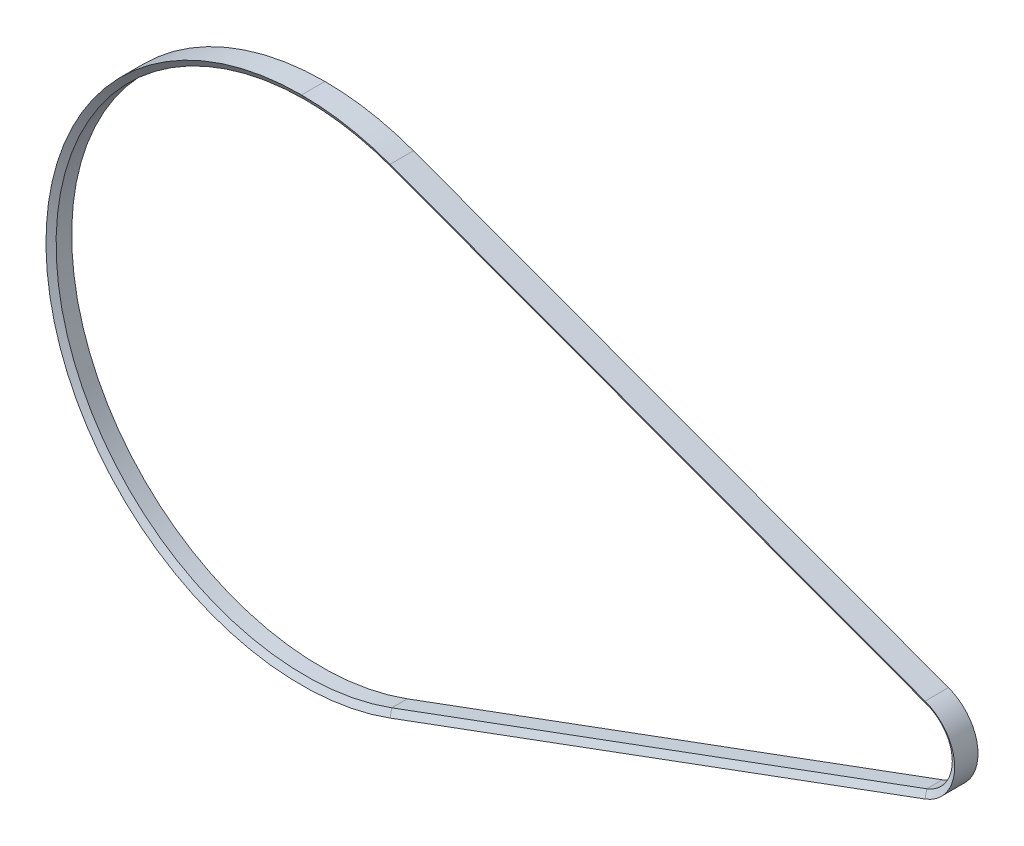
ISO-10303-21;
HEADER;
FILE_DESCRIPTION(('STEP AP214'),'2;1');
FILE_NAME('part.step','',(''),(''),'','','');
FILE_SCHEMA(('AUTOMOTIVE_DESIGN { 1 0 10303 214 1 1 1 1 }'));
ENDSEC;
DATA;
#1=APPLICATION_CONTEXT('core data for automotive mechanical design processes');
#2=APPLICATION_PROTOCOL_DEFINITION('international standard','automotive_design',2000,#1);
#3=PRODUCT_CONTEXT('',#1,'mechanical');
#4=PRODUCT('Part','Part','',(#3));
#5=PRODUCT_RELATED_PRODUCT_CATEGORY('part','',(#4));
#6=PRODUCT_DEFINITION_FORMATION('','',#4);
#7=PRODUCT_DEFINITION_CONTEXT('part definition',#1,'design');
#8=PRODUCT_DEFINITION('design','',#6,#7);
#9=PRODUCT_DEFINITION_SHAPE('','',#8);
#10=(LENGTH_UNIT() NAMED_UNIT(*) SI_UNIT(.MILLI.,.METRE.));
#11=(NAMED_UNIT(*) PLANE_ANGLE_UNIT() SI_UNIT($,.RADIAN.));
#12=(NAMED_UNIT(*) SI_UNIT($,.STERADIAN.) SOLID_ANGLE_UNIT());
#13=UNCERTAINTY_MEASURE_WITH_UNIT(LENGTH_MEASURE(1.E-05),#10,'distance_accuracy_value','');
#14=(GEOMETRIC_REPRESENTATION_CONTEXT(3) GLOBAL_UNCERTAINTY_ASSIGNED_CONTEXT((#13)) GLOBAL_UNIT_ASSIGNED_CONTEXT((#10,
#11,#12)) REPRESENTATION_CONTEXT('',''));
#15=CARTESIAN_POINT('',(0.,0.,0.));
#16=DIRECTION('',(0.,0.,1.));
#17=DIRECTION('',(1.,0.,0.));
#18=AXIS2_PLACEMENT_3D('',#15,#16,#17);
#19=CARTESIAN_POINT('',(0.,0.,0.));
#20=DIRECTION('',(0.,0.,-1.));
#21=DIRECTION('',(-1.,0.,0.));
#22=AXIS2_PLACEMENT_3D('',#19,#20,#21);
#23=CYLINDRICAL_SURFACE('',#22,208.28);
#24=CARTESIAN_POINT('',(0.,0.,-9.52499999999999));
#25=DIRECTION('',(0.,0.,-1.));
#26=DIRECTION('',(0.346153846153846,-0.93817776289619,0.));
#27=AXIS2_PLACEMENT_3D('',#24,#25,#26);
#28=CIRCLE('',#27,208.28);
#29=CARTESIAN_POINT('',(72.096923076923,-195.403664456018,-9.52499999999999));
#30=VERTEX_POINT('',#29);
#31=CARTESIAN_POINT('',(0.,208.28,-9.52499999999999));
#32=VERTEX_POINT('',#31);
#33=EDGE_CURVE('E11',#30,#32,#28,.T.);
#34=ORIENTED_EDGE('',*,*,#33,.F.);
#35=DIRECTION('',(0.,0.,1.));
#36=VECTOR('',#35,1.);
#37=CARTESIAN_POINT('',(72.0969230769231,-195.403664456018,9.52500000000001));
#38=LINE('',#37,#36);
#39=CARTESIAN_POINT('',(72.096923076923,-195.403664456018,9.52500000000001));
#40=VERTEX_POINT('',#39);
#41=EDGE_CURVE('E36',#30,#40,#38,.T.);
#42=ORIENTED_EDGE('',*,*,#41,.T.);
#43=CARTESIAN_POINT('',(0.,0.,9.52500000000001));
#44=DIRECTION('',(0.,0.,-1.));
#45=DIRECTION('',(0.346153846153846,-0.93817776289619,0.));
#46=AXIS2_PLACEMENT_3D('',#43,#44,#45);
#47=CIRCLE('',#46,208.28);
#48=CARTESIAN_POINT('',(0.,208.28,9.52500000000001));
#49=VERTEX_POINT('',#48);
#50=EDGE_CURVE('E130',#40,#49,#47,.T.);
#51=ORIENTED_EDGE('',*,*,#50,.T.);
#52=DIRECTION('',(0.,0.,1.));
#53=VECTOR('',#52,1.);
#54=CARTESIAN_POINT('',(0.,208.28,9.52500000000001));
#55=LINE('',#54,#53);
#56=EDGE_CURVE('E133',#32,#49,#55,.T.);
#57=ORIENTED_EDGE('',*,*,#56,.F.);
#58=EDGE_LOOP('',(#34,#42,#51,#57));
#59=FACE_BOUND('',#58,.T.);
#60=ADVANCED_FACE('F33',(#59),#23,.T.);
#61=CARTESIAN_POINT('',(0.,0.,-6.35));
#62=DIRECTION('',(0.,0.,-1.));
#63=DIRECTION('',(-1.,0.,0.));
#64=AXIS2_PLACEMENT_3D('',#61,#62,#63);
#65=CONICAL_SURFACE('',#64,203.2,1.01219701145134);
#66=CARTESIAN_POINT('',(0.,0.,-6.35));
#67=DIRECTION('',(0.,0.,-1.));
#68=DIRECTION('',(0.346153846153846,-0.93817776289619,0.));
#69=AXIS2_PLACEMENT_3D('',#66,#67,#68);
#70=CIRCLE('',#69,203.2);
#71=CARTESIAN_POINT('',(70.3384615384615,-190.637721420506,-6.35));
#72=VERTEX_POINT('',#71);
#73=CARTESIAN_POINT('',(0.,203.2,-6.35));
#74=VERTEX_POINT('',#73);
#75=EDGE_CURVE('E41',#72,#74,#70,.T.);
#76=ORIENTED_EDGE('',*,*,#75,.F.);
#77=DIRECTION('',(0.293537874463301,-0.79557315179126,-0.529998940003174));
#78=VECTOR('',#77,1.);
#79=CARTESIAN_POINT('',(72.0969230769231,-195.403664456018,-9.52499999999999));
#80=LINE('',#79,#78);
#81=EDGE_CURVE('E216',#72,#30,#80,.T.);
#82=ORIENTED_EDGE('',*,*,#81,.T.);
#83=ORIENTED_EDGE('',*,*,#33,.T.);
#84=DIRECTION('',(0.,0.847998304005092,-0.529998940003174));
#85=VECTOR('',#84,1.);
#86=CARTESIAN_POINT('',(0.,208.28,-9.52499999999999));
#87=LINE('',#86,#85);
#88=EDGE_CURVE('E158',#74,#32,#87,.T.);
#89=ORIENTED_EDGE('',*,*,#88,.F.);
#90=EDGE_LOOP('',(#76,#82,#83,#89));
#91=FACE_BOUND('',#90,.T.);
#92=ADVANCED_FACE('F275',(#91),#65,.F.);
#93=CARTESIAN_POINT('',(0.,0.,0.));
#94=DIRECTION('',(0.,0.,-1.));
#95=DIRECTION('',(-1.,0.,0.));
#96=AXIS2_PLACEMENT_3D('',#93,#94,#95);
#97=CYLINDRICAL_SURFACE('',#96,203.2);
#98=CARTESIAN_POINT('',(0.,0.,6.35000000000002));
#99=DIRECTION('',(0.,0.,-1.));
#100=DIRECTION('',(0.346153846153846,-0.93817776289619,0.));
#101=AXIS2_PLACEMENT_3D('',#98,#99,#100);
#102=CIRCLE('',#101,203.2);
#103=CARTESIAN_POINT('',(70.3384615384615,-190.637721420506,6.35000000000002));
#104=VERTEX_POINT('',#103);
#105=CARTESIAN_POINT('',(0.,203.2,6.35000000000002));
#106=VERTEX_POINT('',#105);
#107=EDGE_CURVE('E139',#104,#106,#102,.T.);
#108=ORIENTED_EDGE('',*,*,#107,.F.);
#109=DIRECTION('',(0.,0.,-1.));
#110=VECTOR('',#109,1.);
#111=CARTESIAN_POINT('',(70.3384615384615,-190.637721420506,6.35000000000002));
#112=LINE('',#111,#110);
#113=EDGE_CURVE('E194',#104,#72,#112,.T.);
#114=ORIENTED_EDGE('',*,*,#113,.T.);
#115=ORIENTED_EDGE('',*,*,#75,.T.);
#116=DIRECTION('',(0.,0.,-1.));
#117=VECTOR('',#116,1.);
#118=CARTESIAN_POINT('',(0.,203.2,6.35000000000002));
#119=LINE('',#118,#117);
#120=EDGE_CURVE('E163',#106,#74,#119,.T.);
#121=ORIENTED_EDGE('',*,*,#120,.F.);
#122=EDGE_LOOP('',(#108,#114,#115,#121));
#123=FACE_BOUND('',#122,.T.);
#124=ADVANCED_FACE('F279',(#123),#97,.F.);
#125=CARTESIAN_POINT('',(508.048846153846,-34.5530870074667,9.52500000000001));
#126=DIRECTION('',(0.346153846153846,-0.93817776289619,0.));
#127=DIRECTION('',(0.93817776289619,0.346153846153846,0.));
#128=AXIS2_PLACEMENT_3D('',#125,#126,#127);
#129=PLANE('',#128);
#130=ORIENTED_EDGE('',*,*,#41,.F.);
#131=DIRECTION('',(-0.93817776289619,-0.346153846153846,0.));
#132=VECTOR('',#131,1.);
#133=CARTESIAN_POINT('',(508.048846153846,-34.5530870074667,-9.52499999999999));
#134=LINE('',#133,#132);
#135=CARTESIAN_POINT('',(508.048846153846,-34.5530870074667,-9.52499999999999));
#136=VERTEX_POINT('',#135);
#137=EDGE_CURVE('E49',#136,#30,#134,.T.);
#138=ORIENTED_EDGE('',*,*,#137,.F.);
#139=DIRECTION('',(0.,0.,1.));
#140=VECTOR('',#139,1.);
#141=CARTESIAN_POINT('',(508.048846153846,-34.5530870074667,9.52500000000001));
#142=LINE('',#141,#140);
#143=CARTESIAN_POINT('',(508.048846153846,-34.5530870074667,9.52500000000001));
#144=VERTEX_POINT('',#143);
#145=EDGE_CURVE('E198',#136,#144,#142,.T.);
#146=ORIENTED_EDGE('',*,*,#145,.T.);
#147=DIRECTION('',(-0.93817776289619,-0.346153846153846,0.));
#148=VECTOR('',#147,1.);
#149=CARTESIAN_POINT('',(508.048846153846,-34.5530870074667,9.52500000000001));
#150=LINE('',#149,#148);
#151=EDGE_CURVE('E196',#144,#40,#150,.T.);
#152=ORIENTED_EDGE('',*,*,#151,.T.);
#153=EDGE_LOOP('',(#130,#138,#146,#152));
#154=FACE_BOUND('',#153,.T.);
#155=ADVANCED_FACE('F238',(#154),#129,.T.);
#156=CARTESIAN_POINT('',(508.048846153846,-34.5530870074667,-9.52499999999999));
#157=DIRECTION('',(-0.18346117153956,0.49723321986953,-0.847998304005092));
#158=DIRECTION('',(0.,0.862639928451234,0.50581849891206));
#159=AXIS2_PLACEMENT_3D('',#156,#157,#158);
#160=PLANE('',#159);
#161=ORIENTED_EDGE('',*,*,#137,.T.);
#162=ORIENTED_EDGE('',*,*,#81,.F.);
#163=DIRECTION('',(-0.93817776289619,-0.346153846153846,0.));
#164=VECTOR('',#163,1.);
#165=CARTESIAN_POINT('',(506.290384615385,-29.787143971954,-6.35));
#166=LINE('',#165,#164);
#167=CARTESIAN_POINT('',(506.290384615385,-29.787143971954,-6.35));
#168=VERTEX_POINT('',#167);
#169=EDGE_CURVE('E58',#168,#72,#166,.T.);
#170=ORIENTED_EDGE('',*,*,#169,.F.);
#171=DIRECTION('',(0.293537874463303,-0.795573151791259,-0.529998940003174));
#172=VECTOR('',#171,1.);
#173=CARTESIAN_POINT('',(508.048846153846,-34.5530870074667,-9.52499999999999));
#174=LINE('',#173,#172);
#175=EDGE_CURVE('E213',#168,#136,#174,.T.);
#176=ORIENTED_EDGE('',*,*,#175,.T.);
#177=EDGE_LOOP('',(#161,#162,#170,#176));
#178=FACE_BOUND('',#177,.T.);
#179=ADVANCED_FACE('F264',(#178),#160,.T.);
#180=CARTESIAN_POINT('',(506.290384615385,-29.787143971954,6.35000000000002));
#181=DIRECTION('',(-0.346153846153846,0.93817776289619,0.));
#182=DIRECTION('',(-0.93817776289619,-0.346153846153846,0.));
#183=AXIS2_PLACEMENT_3D('',#180,#181,#182);
#184=PLANE('',#183);
#185=ORIENTED_EDGE('',*,*,#169,.T.);
#186=ORIENTED_EDGE('',*,*,#113,.F.);
#187=DIRECTION('',(-0.93817776289619,-0.346153846153846,0.));
#188=VECTOR('',#187,1.);
#189=CARTESIAN_POINT('',(506.290384615385,-29.787143971954,6.35000000000002));
#190=LINE('',#189,#188);
#191=CARTESIAN_POINT('',(506.290384615385,-29.787143971954,6.35000000000002));
#192=VERTEX_POINT('',#191);
#193=EDGE_CURVE('E91',#192,#104,#190,.T.);
#194=ORIENTED_EDGE('',*,*,#193,.F.);
#195=DIRECTION('',(0.,0.,-1.));
#196=VECTOR('',#195,1.);
#197=CARTESIAN_POINT('',(506.290384615385,-29.787143971954,6.35000000000002));
#198=LINE('',#197,#196);
#199=EDGE_CURVE('E188',#192,#168,#198,.T.);
#200=ORIENTED_EDGE('',*,*,#199,.T.);
#201=EDGE_LOOP('',(#185,#186,#194,#200));
#202=FACE_BOUND('',#201,.T.);
#203=ADVANCED_FACE('F261',(#202),#184,.T.);
#204=CARTESIAN_POINT('',(508.048846153846,-34.5530870074667,9.52500000000001));
#205=DIRECTION('',(-0.18346117153956,0.49723321986953,0.847998304005092));
#206=DIRECTION('',(0.,-0.862639928451234,0.50581849891206));
#207=AXIS2_PLACEMENT_3D('',#204,#205,#206);
#208=PLANE('',#207);
#209=ORIENTED_EDGE('',*,*,#193,.T.);
#210=DIRECTION('',(-0.293537874463301,0.79557315179126,-0.529998940003174));
#211=VECTOR('',#210,1.);
#212=CARTESIAN_POINT('',(72.0969230769231,-195.403664456018,9.52500000000001));
#213=LINE('',#212,#211);
#214=EDGE_CURVE('E192',#40,#104,#213,.T.);
#215=ORIENTED_EDGE('',*,*,#214,.F.);
#216=ORIENTED_EDGE('',*,*,#151,.F.);
#217=DIRECTION('',(-0.293537874463303,0.795573151791259,-0.529998940003174));
#218=VECTOR('',#217,1.);
#219=CARTESIAN_POINT('',(508.048846153846,-34.5530870074667,9.52500000000001));
#220=LINE('',#219,#218);
#221=EDGE_CURVE('E183',#144,#192,#220,.T.);
#222=ORIENTED_EDGE('',*,*,#221,.T.);
#223=EDGE_LOOP('',(#209,#215,#216,#222));
#224=FACE_BOUND('',#223,.T.);
#225=ADVANCED_FACE('F263',(#224),#208,.T.);
#226=CARTESIAN_POINT('',(495.3,0.,0.));
#227=DIRECTION('',(0.,0.,-1.));
#228=DIRECTION('',(-1.,0.,0.));
#229=AXIS2_PLACEMENT_3D('',#226,#227,#228);
#230=CYLINDRICAL_SURFACE('',#229,36.83);
#231=ORIENTED_EDGE('',*,*,#145,.F.);
#232=CARTESIAN_POINT('',(495.3,0.,-9.52499999999999));
#233=DIRECTION('',(0.,0.,-1.));
#234=DIRECTION('',(0.346153846153847,0.93817776289619,0.));
#235=AXIS2_PLACEMENT_3D('',#232,#233,#234);
#236=CIRCLE('',#235,36.83);
#237=CARTESIAN_POINT('',(508.048846153846,34.5530870074667,-9.52499999999999));
#238=VERTEX_POINT('',#237);
#239=EDGE_CURVE('E228',#238,#136,#236,.T.);
#240=ORIENTED_EDGE('',*,*,#239,.F.);
#241=DIRECTION('',(0.,0.,1.));
#242=VECTOR('',#241,1.);
#243=CARTESIAN_POINT('',(508.048846153846,34.5530870074667,9.52500000000001));
#244=LINE('',#243,#242);
#245=CARTESIAN_POINT('',(508.048846153846,34.5530870074667,9.52500000000001));
#246=VERTEX_POINT('',#245);
#247=EDGE_CURVE('E191',#238,#246,#244,.T.);
#248=ORIENTED_EDGE('',*,*,#247,.T.);
#249=CARTESIAN_POINT('',(495.3,0.,9.52500000000001));
#250=DIRECTION('',(0.,0.,-1.));
#251=DIRECTION('',(0.346153846153847,0.93817776289619,0.));
#252=AXIS2_PLACEMENT_3D('',#249,#250,#251);
#253=CIRCLE('',#252,36.83);
#254=EDGE_CURVE('E186',#246,#144,#253,.T.);
#255=ORIENTED_EDGE('',*,*,#254,.T.);
#256=EDGE_LOOP('',(#231,#240,#248,#255));
#257=FACE_BOUND('',#256,.T.);
#258=ADVANCED_FACE('F243',(#257),#230,.T.);
#259=CARTESIAN_POINT('',(495.3,0.,-6.35));
#260=DIRECTION('',(0.,0.,-1.));
#261=DIRECTION('',(-1.,0.,0.));
#262=AXIS2_PLACEMENT_3D('',#259,#260,#261);
#263=CONICAL_SURFACE('',#262,31.75,1.01219701145134);
#264=ORIENTED_EDGE('',*,*,#239,.T.);
#265=ORIENTED_EDGE('',*,*,#175,.F.);
#266=CARTESIAN_POINT('',(495.3,0.,-6.35));
#267=DIRECTION('',(0.,0.,-1.));
#268=DIRECTION('',(0.346153846153846,0.93817776289619,0.));
#269=AXIS2_PLACEMENT_3D('',#266,#267,#268);
#270=CIRCLE('',#269,31.75);
#271=CARTESIAN_POINT('',(506.290384615385,29.787143971954,-6.35));
#272=VERTEX_POINT('',#271);
#273=EDGE_CURVE('E107',#272,#168,#270,.T.);
#274=ORIENTED_EDGE('',*,*,#273,.F.);
#275=DIRECTION('',(0.293537874463301,0.79557315179126,-0.529998940003174));
#276=VECTOR('',#275,1.);
#277=CARTESIAN_POINT('',(508.048846153846,34.5530870074667,-9.52499999999999));
#278=LINE('',#277,#276);
#279=EDGE_CURVE('E210',#272,#238,#278,.T.);
#280=ORIENTED_EDGE('',*,*,#279,.T.);
#281=EDGE_LOOP('',(#264,#265,#274,#280));
#282=FACE_BOUND('',#281,.T.);
#283=ADVANCED_FACE('F293',(#282),#263,.F.);
#284=CARTESIAN_POINT('',(495.3,0.,0.));
#285=DIRECTION('',(0.,0.,-1.));
#286=DIRECTION('',(-1.,0.,0.));
#287=AXIS2_PLACEMENT_3D('',#284,#285,#286);
#288=CYLINDRICAL_SURFACE('',#287,31.75);
#289=ORIENTED_EDGE('',*,*,#273,.T.);
#290=ORIENTED_EDGE('',*,*,#199,.F.);
#291=CARTESIAN_POINT('',(495.3,0.,6.35000000000002));
#292=DIRECTION('',(0.,0.,-1.));
#293=DIRECTION('',(0.346153846153846,0.93817776289619,0.));
#294=AXIS2_PLACEMENT_3D('',#291,#292,#293);
#295=CIRCLE('',#294,31.75);
#296=CARTESIAN_POINT('',(506.290384615385,29.787143971954,6.35000000000002));
#297=VERTEX_POINT('',#296);
#298=EDGE_CURVE('E113',#297,#192,#295,.T.);
#299=ORIENTED_EDGE('',*,*,#298,.F.);
#300=DIRECTION('',(0.,0.,-1.));
#301=VECTOR('',#300,1.);
#302=CARTESIAN_POINT('',(506.290384615385,29.787143971954,6.35000000000002));
#303=LINE('',#302,#301);
#304=EDGE_CURVE('E179',#297,#272,#303,.T.);
#305=ORIENTED_EDGE('',*,*,#304,.T.);
#306=EDGE_LOOP('',(#289,#290,#299,#305));
#307=FACE_BOUND('',#306,.T.);
#308=ADVANCED_FACE('F260',(#307),#288,.F.);
#309=CARTESIAN_POINT('',(495.3,0.,9.52500000000001));
#310=DIRECTION('',(0.,0.,1.));
#311=DIRECTION('',(1.,0.,0.));
#312=AXIS2_PLACEMENT_3D('',#309,#310,#311);
#313=CONICAL_SURFACE('',#312,36.83,1.01219701145134);
#314=ORIENTED_EDGE('',*,*,#298,.T.);
#315=ORIENTED_EDGE('',*,*,#221,.F.);
#316=ORIENTED_EDGE('',*,*,#254,.F.);
#317=DIRECTION('',(-0.293537874463301,-0.79557315179126,-0.529998940003174));
#318=VECTOR('',#317,1.);
#319=CARTESIAN_POINT('',(508.048846153846,34.5530870074667,9.52500000000001));
#320=LINE('',#319,#318);
#321=EDGE_CURVE('E172',#246,#297,#320,.T.);
#322=ORIENTED_EDGE('',*,*,#321,.T.);
#323=EDGE_LOOP('',(#314,#315,#316,#322));
#324=FACE_BOUND('',#323,.T.);
#325=ADVANCED_FACE('F241',(#324),#313,.F.);
#326=CARTESIAN_POINT('',(72.0969230769231,195.403664456018,9.52500000000001));
#327=DIRECTION('',(0.346153846153846,0.93817776289619,0.));
#328=DIRECTION('',(-0.93817776289619,0.346153846153846,0.));
#329=AXIS2_PLACEMENT_3D('',#326,#327,#328);
#330=PLANE('',#329);
#331=ORIENTED_EDGE('',*,*,#247,.F.);
#332=DIRECTION('',(0.93817776289619,-0.346153846153846,0.));
#333=VECTOR('',#332,1.);
#334=CARTESIAN_POINT('',(72.0969230769231,195.403664456018,-9.52499999999999));
#335=LINE('',#334,#333);
#336=CARTESIAN_POINT('',(72.0969230769232,195.403664456018,-9.52499999999999));
#337=VERTEX_POINT('',#336);
#338=EDGE_CURVE('E224',#337,#238,#335,.T.);
#339=ORIENTED_EDGE('',*,*,#338,.F.);
#340=DIRECTION('',(0.,0.,1.));
#341=VECTOR('',#340,1.);
#342=CARTESIAN_POINT('',(72.0969230769232,195.403664456018,9.52500000000001));
#343=LINE('',#342,#341);
#344=CARTESIAN_POINT('',(72.0969230769232,195.403664456018,9.52500000000001));
#345=VERTEX_POINT('',#344);
#346=EDGE_CURVE('E182',#337,#345,#343,.T.);
#347=ORIENTED_EDGE('',*,*,#346,.T.);
#348=DIRECTION('',(0.93817776289619,-0.346153846153846,0.));
#349=VECTOR('',#348,1.);
#350=CARTESIAN_POINT('',(72.0969230769231,195.403664456018,9.52500000000001));
#351=LINE('',#350,#349);
#352=EDGE_CURVE('E176',#345,#246,#351,.T.);
#353=ORIENTED_EDGE('',*,*,#352,.T.);
#354=EDGE_LOOP('',(#331,#339,#347,#353));
#355=FACE_BOUND('',#354,.T.);
#356=ADVANCED_FACE('F249',(#355),#330,.T.);
#357=CARTESIAN_POINT('',(72.0969230769231,195.403664456018,-9.52499999999999));
#358=DIRECTION('',(-0.18346117153956,-0.49723321986953,-0.847998304005091));
#359=DIRECTION('',(0.,0.862639928451234,-0.50581849891206));
#360=AXIS2_PLACEMENT_3D('',#357,#358,#359);
#361=PLANE('',#360);
#362=ORIENTED_EDGE('',*,*,#338,.T.);
#363=ORIENTED_EDGE('',*,*,#279,.F.);
#364=DIRECTION('',(0.93817776289619,-0.346153846153846,0.));
#365=VECTOR('',#364,1.);
#366=CARTESIAN_POINT('',(70.3384615384616,190.637721420506,-6.35));
#367=LINE('',#366,#365);
#368=CARTESIAN_POINT('',(70.3384615384616,190.637721420506,-6.35));
#369=VERTEX_POINT('',#368);
#370=EDGE_CURVE('E207',#369,#272,#367,.T.);
#371=ORIENTED_EDGE('',*,*,#370,.F.);
#372=DIRECTION('',(0.293537874463301,0.79557315179126,-0.529998940003174));
#373=VECTOR('',#372,1.);
#374=CARTESIAN_POINT('',(72.0969230769232,195.403664456018,-9.52499999999999));
#375=LINE('',#374,#373);
#376=EDGE_CURVE('E205',#369,#337,#375,.T.);
#377=ORIENTED_EDGE('',*,*,#376,.T.);
#378=EDGE_LOOP('',(#362,#363,#371,#377));
#379=FACE_BOUND('',#378,.T.);
#380=ADVANCED_FACE('F256',(#379),#361,.T.);
#381=CARTESIAN_POINT('',(70.3384615384616,190.637721420506,6.35000000000002));
#382=DIRECTION('',(-0.346153846153846,-0.93817776289619,0.));
#383=DIRECTION('',(0.93817776289619,-0.346153846153846,0.));
#384=AXIS2_PLACEMENT_3D('',#381,#382,#383);
#385=PLANE('',#384);
#386=ORIENTED_EDGE('',*,*,#370,.T.);
#387=ORIENTED_EDGE('',*,*,#304,.F.);
#388=DIRECTION('',(0.93817776289619,-0.346153846153846,0.));
#389=VECTOR('',#388,1.);
#390=CARTESIAN_POINT('',(70.3384615384616,190.637721420506,6.35000000000002));
#391=LINE('',#390,#389);
#392=CARTESIAN_POINT('',(70.3384615384616,190.637721420506,6.35000000000002));
#393=VERTEX_POINT('',#392);
#394=EDGE_CURVE('E175',#393,#297,#391,.T.);
#395=ORIENTED_EDGE('',*,*,#394,.F.);
#396=DIRECTION('',(0.,0.,-1.));
#397=VECTOR('',#396,1.);
#398=CARTESIAN_POINT('',(70.3384615384616,190.637721420506,6.35000000000002));
#399=LINE('',#398,#397);
#400=EDGE_CURVE('E170',#393,#369,#399,.T.);
#401=ORIENTED_EDGE('',*,*,#400,.T.);
#402=EDGE_LOOP('',(#386,#387,#395,#401));
#403=FACE_BOUND('',#402,.T.);
#404=ADVANCED_FACE('F258',(#403),#385,.T.);
#405=CARTESIAN_POINT('',(72.0969230769231,195.403664456018,9.52500000000001));
#406=DIRECTION('',(-0.18346117153956,-0.49723321986953,0.847998304005091));
#407=DIRECTION('',(0.,-0.862639928451234,-0.50581849891206));
#408=AXIS2_PLACEMENT_3D('',#405,#406,#407);
#409=PLANE('',#408);
#410=ORIENTED_EDGE('',*,*,#394,.T.);
#411=ORIENTED_EDGE('',*,*,#321,.F.);
#412=ORIENTED_EDGE('',*,*,#352,.F.);
#413=DIRECTION('',(-0.293537874463301,-0.79557315179126,-0.529998940003174));
#414=VECTOR('',#413,1.);
#415=CARTESIAN_POINT('',(72.0969230769232,195.403664456018,9.52500000000001));
#416=LINE('',#415,#414);
#417=EDGE_CURVE('E150',#345,#393,#416,.T.);
#418=ORIENTED_EDGE('',*,*,#417,.T.);
#419=EDGE_LOOP('',(#410,#411,#412,#418));
#420=FACE_BOUND('',#419,.T.);
#421=ADVANCED_FACE('F248',(#420),#409,.T.);
#422=CARTESIAN_POINT('',(0.,0.,0.));
#423=DIRECTION('',(0.,0.,-1.));
#424=DIRECTION('',(-1.,0.,0.));
#425=AXIS2_PLACEMENT_3D('',#422,#423,#424);
#426=CYLINDRICAL_SURFACE('',#425,208.28);
#427=ORIENTED_EDGE('',*,*,#346,.F.);
#428=CARTESIAN_POINT('',(0.,0.,-9.52499999999999));
#429=DIRECTION('',(0.,0.,-1.));
#430=DIRECTION('',(0.,1.,0.));
#431=AXIS2_PLACEMENT_3D('',#428,#429,#430);
#432=CIRCLE('',#431,208.28);
#433=EDGE_CURVE('E157',#32,#337,#432,.T.);
#434=ORIENTED_EDGE('',*,*,#433,.F.);
#435=ORIENTED_EDGE('',*,*,#56,.T.);
#436=CARTESIAN_POINT('',(0.,0.,9.52500000000001));
#437=DIRECTION('',(0.,0.,-1.));
#438=DIRECTION('',(0.,1.,0.));
#439=AXIS2_PLACEMENT_3D('',#436,#437,#438);
#440=CIRCLE('',#439,208.28);
#441=EDGE_CURVE('E145',#49,#345,#440,.T.);
#442=ORIENTED_EDGE('',*,*,#441,.T.);
#443=EDGE_LOOP('',(#427,#434,#435,#442));
#444=FACE_BOUND('',#443,.T.);
#445=ADVANCED_FACE('F155',(#444),#426,.T.);
#446=CARTESIAN_POINT('',(0.,0.,-6.35));
#447=DIRECTION('',(0.,0.,-1.));
#448=DIRECTION('',(-1.,0.,0.));
#449=AXIS2_PLACEMENT_3D('',#446,#447,#448);
#450=CONICAL_SURFACE('',#449,203.2,1.01219701145134);
#451=ORIENTED_EDGE('',*,*,#433,.T.);
#452=ORIENTED_EDGE('',*,*,#376,.F.);
#453=CARTESIAN_POINT('',(0.,0.,-6.35));
#454=DIRECTION('',(0.,0.,-1.));
#455=DIRECTION('',(0.,1.,0.));
#456=AXIS2_PLACEMENT_3D('',#453,#454,#455);
#457=CIRCLE('',#456,203.2);
#458=EDGE_CURVE('E202',#74,#369,#457,.T.);
#459=ORIENTED_EDGE('',*,*,#458,.F.);
#460=ORIENTED_EDGE('',*,*,#88,.T.);
#461=EDGE_LOOP('',(#451,#452,#459,#460));
#462=FACE_BOUND('',#461,.T.);
#463=ADVANCED_FACE('F252',(#462),#450,.F.);
#464=CARTESIAN_POINT('',(0.,0.,0.));
#465=DIRECTION('',(0.,0.,-1.));
#466=DIRECTION('',(-1.,0.,0.));
#467=AXIS2_PLACEMENT_3D('',#464,#465,#466);
#468=CYLINDRICAL_SURFACE('',#467,203.2);
#469=ORIENTED_EDGE('',*,*,#458,.T.);
#470=ORIENTED_EDGE('',*,*,#400,.F.);
#471=CARTESIAN_POINT('',(0.,0.,6.35000000000002));
#472=DIRECTION('',(0.,0.,-1.));
#473=DIRECTION('',(0.,1.,0.));
#474=AXIS2_PLACEMENT_3D('',#471,#472,#473);
#475=CIRCLE('',#474,203.2);
#476=EDGE_CURVE('E169',#106,#393,#475,.T.);
#477=ORIENTED_EDGE('',*,*,#476,.F.);
#478=ORIENTED_EDGE('',*,*,#120,.T.);
#479=EDGE_LOOP('',(#469,#470,#477,#478));
#480=FACE_BOUND('',#479,.T.);
#481=ADVANCED_FACE('F386',(#480),#468,.F.);
#482=CARTESIAN_POINT('',(0.,0.,9.52500000000001));
#483=DIRECTION('',(0.,0.,1.));
#484=DIRECTION('',(1.,0.,0.));
#485=AXIS2_PLACEMENT_3D('',#482,#483,#484);
#486=CONICAL_SURFACE('',#485,208.28,1.01219701145134);
#487=ORIENTED_EDGE('',*,*,#476,.T.);
#488=ORIENTED_EDGE('',*,*,#417,.F.);
#489=ORIENTED_EDGE('',*,*,#441,.F.);
#490=DIRECTION('',(0.,-0.847998304005092,-0.529998940003174));
#491=VECTOR('',#490,1.);
#492=CARTESIAN_POINT('',(0.,208.28,9.52500000000001));
#493=LINE('',#492,#491);
#494=EDGE_CURVE('E148',#49,#106,#493,.T.);
#495=ORIENTED_EDGE('',*,*,#494,.T.);
#496=EDGE_LOOP('',(#487,#488,#489,#495));
#497=FACE_BOUND('',#496,.T.);
#498=ADVANCED_FACE('F147',(#497),#486,.F.);
#499=CARTESIAN_POINT('',(0.,0.,9.52500000000001));
#500=DIRECTION('',(0.,0.,1.));
#501=DIRECTION('',(1.,0.,0.));
#502=AXIS2_PLACEMENT_3D('',#499,#500,#501);
#503=CONICAL_SURFACE('',#502,208.28,1.01219701145134);
#504=ORIENTED_EDGE('',*,*,#214,.T.);
#505=ORIENTED_EDGE('',*,*,#107,.T.);
#506=ORIENTED_EDGE('',*,*,#494,.F.);
#507=ORIENTED_EDGE('',*,*,#50,.F.);
#508=EDGE_LOOP('',(#504,#505,#506,#507));
#509=FACE_BOUND('',#508,.T.);
#510=ADVANCED_FACE('F160',(#509),#503,.F.);
#511=CLOSED_SHELL('',(#60,#92,#124,#155,#179,#203,#225,#258,#283,#308,#325,#356,#380,#404,#421,
#445,#463,#481,#498,#510));
#512=MANIFOLD_SOLID_BREP('B2',#511);
#513=ADVANCED_BREP_SHAPE_REPRESENTATION('',(#18,#512),#14);
#514=SHAPE_DEFINITION_REPRESENTATION(#9,#513);
ENDSEC;
END-ISO-10303-21;
